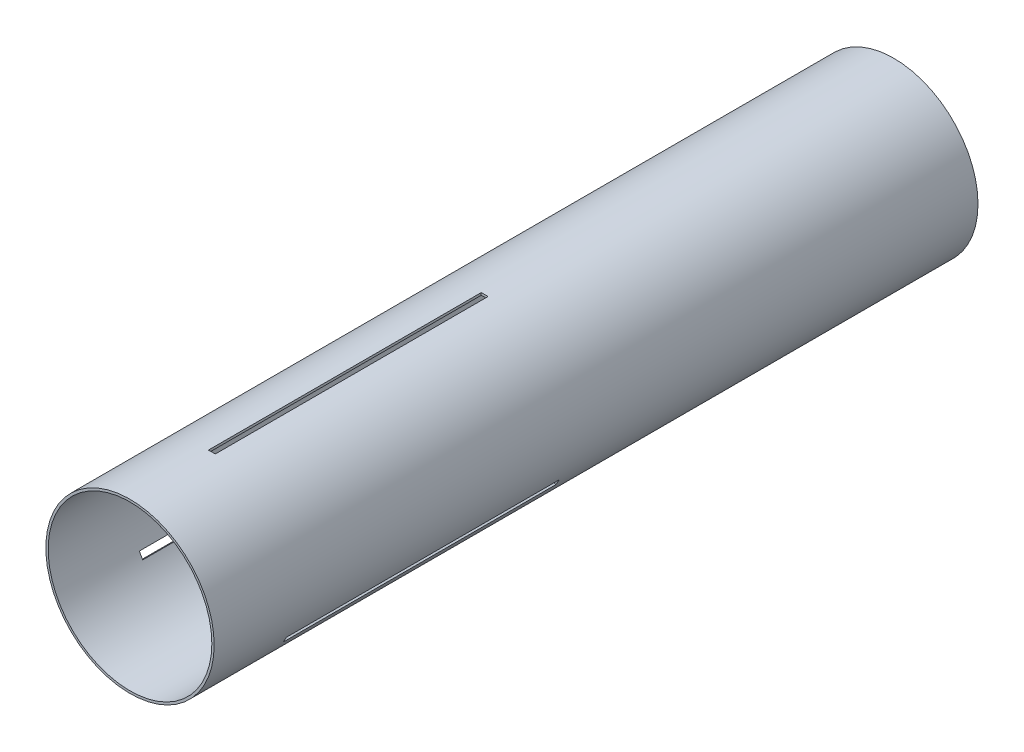
ISO-10303-21;
HEADER;
FILE_DESCRIPTION(('STEP AP214'),'2;1');
FILE_NAME('part.step','',(''),(''),'','','');
FILE_SCHEMA(('AUTOMOTIVE_DESIGN { 1 0 10303 214 1 1 1 1 }'));
ENDSEC;
DATA;
#1=APPLICATION_CONTEXT('core data for automotive mechanical design processes');
#2=APPLICATION_PROTOCOL_DEFINITION('international standard','automotive_design',2000,#1);
#3=PRODUCT_CONTEXT('',#1,'mechanical');
#4=PRODUCT('Part','Part','',(#3));
#5=PRODUCT_RELATED_PRODUCT_CATEGORY('part','',(#4));
#6=PRODUCT_DEFINITION_FORMATION('','',#4);
#7=PRODUCT_DEFINITION_CONTEXT('part definition',#1,'design');
#8=PRODUCT_DEFINITION('design','',#6,#7);
#9=PRODUCT_DEFINITION_SHAPE('','',#8);
#10=(LENGTH_UNIT() NAMED_UNIT(*) SI_UNIT(.MILLI.,.METRE.));
#11=(NAMED_UNIT(*) PLANE_ANGLE_UNIT() SI_UNIT($,.RADIAN.));
#12=(NAMED_UNIT(*) SI_UNIT($,.STERADIAN.) SOLID_ANGLE_UNIT());
#13=UNCERTAINTY_MEASURE_WITH_UNIT(LENGTH_MEASURE(1.E-05),#10,'distance_accuracy_value','');
#14=(GEOMETRIC_REPRESENTATION_CONTEXT(3) GLOBAL_UNCERTAINTY_ASSIGNED_CONTEXT((#13)) GLOBAL_UNIT_ASSIGNED_CONTEXT((#10,
#11,#12)) REPRESENTATION_CONTEXT('',''));
#15=CARTESIAN_POINT('',(0.,0.,0.));
#16=DIRECTION('',(0.,0.,1.));
#17=DIRECTION('',(1.,0.,0.));
#18=AXIS2_PLACEMENT_3D('',#15,#16,#17);
#19=CARTESIAN_POINT('',(0.,0.,711.2));
#20=DIRECTION('',(0.,0.,-1.));
#21=DIRECTION('',(-1.,0.,0.));
#22=AXIS2_PLACEMENT_3D('',#19,#20,#21);
#23=CYLINDRICAL_SURFACE('',#22,78.359);
#24=DIRECTION('',(0.,0.,-1.));
#25=VECTOR('',#24,1.);
#26=CARTESIAN_POINT('',(66.2176560871294,-41.8969557763647,711.2));
#27=LINE('',#26,#25);
#28=CARTESIAN_POINT('',(66.2176560871294,-41.8969557763646,381.000000000001));
#29=VERTEX_POINT('',#28);
#30=CARTESIAN_POINT('',(66.2176560871294,-41.8969557763646,635.));
#31=VERTEX_POINT('',#30);
#32=EDGE_CURVE('E154',#29,#31,#27,.F.);
#33=ORIENTED_EDGE('',*,*,#32,.T.);
#34=CARTESIAN_POINT('',(0.,0.,635.));
#35=DIRECTION('',(0.,0.,1.));
#36=DIRECTION('',(1.,0.,0.));
#37=AXIS2_PLACEMENT_3D('',#34,#35,#36);
#38=CIRCLE('',#37,78.359);
#39=CARTESIAN_POINT('',(69.3926560871294,-36.3976944623335,635.));
#40=VERTEX_POINT('',#39);
#41=EDGE_CURVE('E144',#31,#40,#38,.T.);
#42=ORIENTED_EDGE('',*,*,#41,.T.);
#43=DIRECTION('',(0.,0.,-1.));
#44=VECTOR('',#43,1.);
#45=CARTESIAN_POINT('',(69.3926560871294,-36.3976944623335,711.2));
#46=LINE('',#45,#44);
#47=CARTESIAN_POINT('',(69.3926560871294,-36.3976944623335,381.000000000001));
#48=VERTEX_POINT('',#47);
#49=EDGE_CURVE('E152',#48,#40,#46,.F.);
#50=ORIENTED_EDGE('',*,*,#49,.F.);
#51=CARTESIAN_POINT('',(0.,0.,381.000000000001));
#52=DIRECTION('',(0.,0.,1.));
#53=DIRECTION('',(1.,0.,0.));
#54=AXIS2_PLACEMENT_3D('',#51,#52,#53);
#55=CIRCLE('',#54,78.359);
#56=EDGE_CURVE('E145',#29,#48,#55,.T.);
#57=ORIENTED_EDGE('',*,*,#56,.F.);
#58=EDGE_LOOP('',(#33,#42,#50,#57));
#59=FACE_BOUND('',#58,.T.);
#60=DIRECTION('',(0.,0.,-1.));
#61=VECTOR('',#60,1.);
#62=CARTESIAN_POINT('',(-3.1750000000001,78.2946502386977,711.2));
#63=LINE('',#62,#61);
#64=CARTESIAN_POINT('',(-3.17500000000008,78.2946502386977,381.000000000001));
#65=VERTEX_POINT('',#64);
#66=CARTESIAN_POINT('',(-3.1750000000001,78.2946502386977,635.));
#67=VERTEX_POINT('',#66);
#68=EDGE_CURVE('E176',#65,#67,#63,.F.);
#69=ORIENTED_EDGE('',*,*,#68,.F.);
#70=CARTESIAN_POINT('',(0.,0.,381.000000000001));
#71=DIRECTION('',(0.,0.,1.));
#72=DIRECTION('',(1.,0.,0.));
#73=AXIS2_PLACEMENT_3D('',#70,#71,#72);
#74=CIRCLE('',#73,78.359);
#75=CARTESIAN_POINT('',(3.17499999999986,78.2946502386977,381.000000000001));
#76=VERTEX_POINT('',#75);
#77=EDGE_CURVE('E168',#76,#65,#74,.T.);
#78=ORIENTED_EDGE('',*,*,#77,.F.);
#79=DIRECTION('',(0.,0.,-1.));
#80=VECTOR('',#79,1.);
#81=CARTESIAN_POINT('',(3.17499999999992,78.2946502386977,711.2));
#82=LINE('',#81,#80);
#83=CARTESIAN_POINT('',(3.17499999999991,78.2946502386977,635.));
#84=VERTEX_POINT('',#83);
#85=EDGE_CURVE('E170',#76,#84,#82,.F.);
#86=ORIENTED_EDGE('',*,*,#85,.T.);
#87=CARTESIAN_POINT('',(0.,0.,635.));
#88=DIRECTION('',(0.,0.,1.));
#89=DIRECTION('',(1.,0.,0.));
#90=AXIS2_PLACEMENT_3D('',#87,#88,#89);
#91=CIRCLE('',#90,78.359);
#92=EDGE_CURVE('E173',#84,#67,#91,.T.);
#93=ORIENTED_EDGE('',*,*,#92,.T.);
#94=EDGE_LOOP('',(#69,#78,#86,#93));
#95=FACE_BOUND('',#94,.T.);
#96=CARTESIAN_POINT('',(0.,0.,711.2));
#97=DIRECTION('',(0.,0.,1.));
#98=DIRECTION('',(1.,0.,0.));
#99=AXIS2_PLACEMENT_3D('',#96,#97,#98);
#100=CIRCLE('',#99,78.359);
#101=CARTESIAN_POINT('',(78.359,0.,711.2));
#102=VERTEX_POINT('',#101);
#103=EDGE_CURVE('E185',#102,#102,#100,.T.);
#104=ORIENTED_EDGE('',*,*,#103,.F.);
#105=EDGE_LOOP('',(#104));
#106=FACE_BOUND('',#105,.T.);
#107=CARTESIAN_POINT('',(0.,0.,0.));
#108=DIRECTION('',(0.,0.,1.));
#109=DIRECTION('',(1.,0.,0.));
#110=AXIS2_PLACEMENT_3D('',#107,#108,#109);
#111=CIRCLE('',#110,78.359);
#112=CARTESIAN_POINT('',(78.359,0.,0.));
#113=VERTEX_POINT('',#112);
#114=EDGE_CURVE('E182',#113,#113,#111,.T.);
#115=ORIENTED_EDGE('',*,*,#114,.T.);
#116=EDGE_LOOP('',(#115));
#117=FACE_BOUND('',#116,.T.);
#118=DIRECTION('',(0.,0.,-1.));
#119=VECTOR('',#118,1.);
#120=CARTESIAN_POINT('',(-66.2176560871299,-41.8969557763639,711.2));
#121=LINE('',#120,#119);
#122=CARTESIAN_POINT('',(-66.2176560871299,-41.8969557763639,381.000000000001));
#123=VERTEX_POINT('',#122);
#124=CARTESIAN_POINT('',(-66.2176560871299,-41.8969557763639,635.));
#125=VERTEX_POINT('',#124);
#126=EDGE_CURVE('E130',#123,#125,#121,.F.);
#127=ORIENTED_EDGE('',*,*,#126,.F.);
#128=CARTESIAN_POINT('',(-69.3926560871298,-36.3976944623327,381.000000000001));
#129=VERTEX_POINT('',#128);
#130=EDGE_CURVE('E136',#129,#123,#55,.T.);
#131=ORIENTED_EDGE('',*,*,#130,.F.);
#132=DIRECTION('',(0.,0.,-1.));
#133=VECTOR('',#132,1.);
#134=CARTESIAN_POINT('',(-69.3926560871298,-36.3976944623327,711.2));
#135=LINE('',#134,#133);
#136=CARTESIAN_POINT('',(-69.3926560871298,-36.3976944623327,635.));
#137=VERTEX_POINT('',#136);
#138=EDGE_CURVE('E122',#129,#137,#135,.F.);
#139=ORIENTED_EDGE('',*,*,#138,.T.);
#140=EDGE_CURVE('E148',#137,#125,#38,.T.);
#141=ORIENTED_EDGE('',*,*,#140,.T.);
#142=EDGE_LOOP('',(#127,#131,#139,#141));
#143=FACE_BOUND('',#142,.T.);
#144=ADVANCED_FACE('F35',(#59,#95,#106,#117,#143),#23,.T.);
#145=CARTESIAN_POINT('',(0.,0.,711.2));
#146=DIRECTION('',(0.,0.,-1.));
#147=DIRECTION('',(-1.,0.,0.));
#148=AXIS2_PLACEMENT_3D('',#145,#146,#147);
#149=CYLINDRICAL_SURFACE('',#148,76.2);
#150=CARTESIAN_POINT('',(0.,0.,635.));
#151=DIRECTION('',(0.,0.,1.));
#152=DIRECTION('',(1.,0.,0.));
#153=AXIS2_PLACEMENT_3D('',#150,#151,#152);
#154=CIRCLE('',#153,76.2);
#155=CARTESIAN_POINT('',(64.3463269119121,-40.8165433733105,635.));
#156=VERTEX_POINT('',#155);
#157=CARTESIAN_POINT('',(67.5213269119121,-35.3172820592793,635.));
#158=VERTEX_POINT('',#157);
#159=EDGE_CURVE('E11',#156,#158,#154,.T.);
#160=ORIENTED_EDGE('',*,*,#159,.F.);
#161=DIRECTION('',(0.,0.,-1.));
#162=VECTOR('',#161,1.);
#163=CARTESIAN_POINT('',(64.3463269119121,-40.8165433733105,711.2));
#164=LINE('',#163,#162);
#165=CARTESIAN_POINT('',(64.3463269119121,-40.8165433733105,381.000000000001));
#166=VERTEX_POINT('',#165);
#167=EDGE_CURVE('E38',#166,#156,#164,.F.);
#168=ORIENTED_EDGE('',*,*,#167,.F.);
#169=CARTESIAN_POINT('',(0.,0.,381.000000000001));
#170=DIRECTION('',(0.,0.,1.));
#171=DIRECTION('',(1.,0.,0.));
#172=AXIS2_PLACEMENT_3D('',#169,#170,#171);
#173=CIRCLE('',#172,76.2);
#174=CARTESIAN_POINT('',(67.5213269119121,-35.3172820592794,381.000000000001));
#175=VERTEX_POINT('',#174);
#176=EDGE_CURVE('E202',#166,#175,#173,.T.);
#177=ORIENTED_EDGE('',*,*,#176,.T.);
#178=DIRECTION('',(0.,0.,-1.));
#179=VECTOR('',#178,1.);
#180=CARTESIAN_POINT('',(67.5213269119121,-35.3172820592793,711.2));
#181=LINE('',#180,#179);
#182=EDGE_CURVE('E206',#175,#158,#181,.F.);
#183=ORIENTED_EDGE('',*,*,#182,.T.);
#184=EDGE_LOOP('',(#160,#168,#177,#183));
#185=FACE_BOUND('',#184,.T.);
#186=CARTESIAN_POINT('',(0.,0.,711.2));
#187=DIRECTION('',(0.,0.,1.));
#188=DIRECTION('',(1.,0.,0.));
#189=AXIS2_PLACEMENT_3D('',#186,#187,#188);
#190=CIRCLE('',#189,76.2);
#191=CARTESIAN_POINT('',(76.2,0.,711.2));
#192=VERTEX_POINT('',#191);
#193=EDGE_CURVE('E179',#192,#192,#190,.T.);
#194=ORIENTED_EDGE('',*,*,#193,.T.);
#195=EDGE_LOOP('',(#194));
#196=FACE_BOUND('',#195,.T.);
#197=CARTESIAN_POINT('',(0.,0.,0.));
#198=DIRECTION('',(0.,0.,1.));
#199=DIRECTION('',(1.,0.,0.));
#200=AXIS2_PLACEMENT_3D('',#197,#198,#199);
#201=CIRCLE('',#200,76.2);
#202=CARTESIAN_POINT('',(76.2,0.,0.));
#203=VERTEX_POINT('',#202);
#204=EDGE_CURVE('E178',#203,#203,#201,.T.);
#205=ORIENTED_EDGE('',*,*,#204,.F.);
#206=EDGE_LOOP('',(#205));
#207=FACE_BOUND('',#206,.T.);
#208=CARTESIAN_POINT('',(0.,0.,381.000000000001));
#209=DIRECTION('',(0.,0.,1.));
#210=DIRECTION('',(1.,0.,0.));
#211=AXIS2_PLACEMENT_3D('',#208,#209,#210);
#212=CIRCLE('',#211,76.2);
#213=CARTESIAN_POINT('',(3.17499999999986,76.1338254325894,381.000000000001));
#214=VERTEX_POINT('',#213);
#215=CARTESIAN_POINT('',(-3.17500000000008,76.1338254325894,381.000000000001));
#216=VERTEX_POINT('',#215);
#217=EDGE_CURVE('E188',#214,#216,#212,.T.);
#218=ORIENTED_EDGE('',*,*,#217,.T.);
#219=DIRECTION('',(0.,0.,-1.));
#220=VECTOR('',#219,1.);
#221=CARTESIAN_POINT('',(-3.1750000000001,76.1338254325894,711.2));
#222=LINE('',#221,#220);
#223=CARTESIAN_POINT('',(-3.1750000000001,76.1338254325894,635.));
#224=VERTEX_POINT('',#223);
#225=EDGE_CURVE('E197',#216,#224,#222,.F.);
#226=ORIENTED_EDGE('',*,*,#225,.T.);
#227=CARTESIAN_POINT('',(0.,0.,635.));
#228=DIRECTION('',(0.,0.,1.));
#229=DIRECTION('',(1.,0.,0.));
#230=AXIS2_PLACEMENT_3D('',#227,#228,#229);
#231=CIRCLE('',#230,76.2);
#232=CARTESIAN_POINT('',(3.17499999999991,76.1338254325894,635.));
#233=VERTEX_POINT('',#232);
#234=EDGE_CURVE('E195',#233,#224,#231,.T.);
#235=ORIENTED_EDGE('',*,*,#234,.F.);
#236=DIRECTION('',(0.,0.,-1.));
#237=VECTOR('',#236,1.);
#238=CARTESIAN_POINT('',(3.17499999999992,76.1338254325894,711.2));
#239=LINE('',#238,#237);
#240=EDGE_CURVE('E193',#214,#233,#239,.F.);
#241=ORIENTED_EDGE('',*,*,#240,.F.);
#242=EDGE_LOOP('',(#218,#226,#235,#241));
#243=FACE_BOUND('',#242,.T.);
#244=CARTESIAN_POINT('',(-67.5213269119125,-35.3172820592786,381.000000000001));
#245=VERTEX_POINT('',#244);
#246=CARTESIAN_POINT('',(-64.3463269119126,-40.8165433733098,381.000000000001));
#247=VERTEX_POINT('',#246);
#248=EDGE_CURVE('E139',#245,#247,#173,.T.);
#249=ORIENTED_EDGE('',*,*,#248,.T.);
#250=DIRECTION('',(0.,0.,-1.));
#251=VECTOR('',#250,1.);
#252=CARTESIAN_POINT('',(-64.3463269119126,-40.8165433733098,711.2));
#253=LINE('',#252,#251);
#254=CARTESIAN_POINT('',(-64.3463269119126,-40.8165433733098,635.));
#255=VERTEX_POINT('',#254);
#256=EDGE_CURVE('E204',#247,#255,#253,.F.);
#257=ORIENTED_EDGE('',*,*,#256,.T.);
#258=CARTESIAN_POINT('',(-67.5213269119125,-35.3172820592786,635.));
#259=VERTEX_POINT('',#258);
#260=EDGE_CURVE('E44',#259,#255,#154,.T.);
#261=ORIENTED_EDGE('',*,*,#260,.F.);
#262=DIRECTION('',(0.,0.,-1.));
#263=VECTOR('',#262,1.);
#264=CARTESIAN_POINT('',(-67.5213269119125,-35.3172820592786,711.2));
#265=LINE('',#264,#263);
#266=EDGE_CURVE('E200',#245,#259,#265,.F.);
#267=ORIENTED_EDGE('',*,*,#266,.F.);
#268=EDGE_LOOP('',(#249,#257,#261,#267));
#269=FACE_BOUND('',#268,.T.);
#270=ADVANCED_FACE('F213',(#185,#196,#207,#243,#269),#149,.F.);
#271=CARTESIAN_POINT('',(0.,0.,711.2));
#272=DIRECTION('',(0.,0.,1.));
#273=DIRECTION('',(1.,0.,0.));
#274=AXIS2_PLACEMENT_3D('',#271,#272,#273);
#275=PLANE('',#274);
#276=ORIENTED_EDGE('',*,*,#103,.T.);
#277=EDGE_LOOP('',(#276));
#278=FACE_BOUND('',#277,.T.);
#279=ORIENTED_EDGE('',*,*,#193,.F.);
#280=EDGE_LOOP('',(#279));
#281=FACE_BOUND('',#280,.T.);
#282=ADVANCED_FACE('F251',(#278,#281),#275,.T.);
#283=CARTESIAN_POINT('',(0.,0.,0.));
#284=DIRECTION('',(0.,0.,1.));
#285=DIRECTION('',(1.,0.,0.));
#286=AXIS2_PLACEMENT_3D('',#283,#284,#285);
#287=PLANE('',#286);
#288=ORIENTED_EDGE('',*,*,#114,.F.);
#289=EDGE_LOOP('',(#288));
#290=FACE_BOUND('',#289,.T.);
#291=ORIENTED_EDGE('',*,*,#204,.T.);
#292=EDGE_LOOP('',(#291));
#293=FACE_BOUND('',#292,.T.);
#294=ADVANCED_FACE('F247',(#290,#293),#287,.F.);
#295=CARTESIAN_POINT('',(-3.17500000000008,153.416,381.000000000001));
#296=DIRECTION('',(1.,0.,0.));
#297=DIRECTION('',(0.,0.,-1.));
#298=AXIS2_PLACEMENT_3D('',#295,#296,#297);
#299=PLANE('',#298);
#300=ORIENTED_EDGE('',*,*,#68,.T.);
#301=DIRECTION('',(0.,-1.,0.));
#302=VECTOR('',#301,1.);
#303=CARTESIAN_POINT('',(-3.1750000000001,153.416,635.));
#304=LINE('',#303,#302);
#305=EDGE_CURVE('E165',#67,#224,#304,.T.);
#306=ORIENTED_EDGE('',*,*,#305,.T.);
#307=ORIENTED_EDGE('',*,*,#225,.F.);
#308=DIRECTION('',(0.,-1.,0.));
#309=VECTOR('',#308,1.);
#310=CARTESIAN_POINT('',(-3.17500000000008,153.416,381.000000000001));
#311=LINE('',#310,#309);
#312=EDGE_CURVE('E157',#65,#216,#311,.T.);
#313=ORIENTED_EDGE('',*,*,#312,.F.);
#314=EDGE_LOOP('',(#300,#306,#307,#313));
#315=FACE_BOUND('',#314,.T.);
#316=ADVANCED_FACE('F250',(#315),#299,.T.);
#317=CARTESIAN_POINT('',(3.17499999999991,153.416,635.));
#318=DIRECTION('',(0.,0.,1.));
#319=DIRECTION('',(1.,0.,0.));
#320=AXIS2_PLACEMENT_3D('',#317,#318,#319);
#321=PLANE('',#320);
#322=DIRECTION('',(0.,-1.,0.));
#323=VECTOR('',#322,1.);
#324=CARTESIAN_POINT('',(3.17499999999991,153.416,635.));
#325=LINE('',#324,#323);
#326=EDGE_CURVE('E162',#84,#233,#325,.T.);
#327=ORIENTED_EDGE('',*,*,#326,.T.);
#328=ORIENTED_EDGE('',*,*,#234,.T.);
#329=ORIENTED_EDGE('',*,*,#305,.F.);
#330=ORIENTED_EDGE('',*,*,#92,.F.);
#331=EDGE_LOOP('',(#327,#328,#329,#330));
#332=FACE_BOUND('',#331,.T.);
#333=ADVANCED_FACE('F290',(#332),#321,.F.);
#334=CARTESIAN_POINT('',(3.17499999999986,153.416,381.000000000001));
#335=DIRECTION('',(1.,0.,0.));
#336=DIRECTION('',(0.,0.,-1.));
#337=AXIS2_PLACEMENT_3D('',#334,#335,#336);
#338=PLANE('',#337);
#339=DIRECTION('',(0.,-1.,0.));
#340=VECTOR('',#339,1.);
#341=CARTESIAN_POINT('',(3.17499999999986,153.416,381.000000000001));
#342=LINE('',#341,#340);
#343=EDGE_CURVE('E159',#76,#214,#342,.T.);
#344=ORIENTED_EDGE('',*,*,#343,.T.);
#345=ORIENTED_EDGE('',*,*,#240,.T.);
#346=ORIENTED_EDGE('',*,*,#326,.F.);
#347=ORIENTED_EDGE('',*,*,#85,.F.);
#348=EDGE_LOOP('',(#344,#345,#346,#347));
#349=FACE_BOUND('',#348,.T.);
#350=ADVANCED_FACE('F276',(#349),#338,.F.);
#351=CARTESIAN_POINT('',(3.17499999999986,153.416,381.000000000001));
#352=DIRECTION('',(0.,0.,1.));
#353=DIRECTION('',(1.,0.,0.));
#354=AXIS2_PLACEMENT_3D('',#351,#352,#353);
#355=PLANE('',#354);
#356=ORIENTED_EDGE('',*,*,#77,.T.);
#357=ORIENTED_EDGE('',*,*,#312,.T.);
#358=ORIENTED_EDGE('',*,*,#217,.F.);
#359=ORIENTED_EDGE('',*,*,#343,.F.);
#360=EDGE_LOOP('',(#356,#357,#358,#359));
#361=FACE_BOUND('',#360,.T.);
#362=ADVANCED_FACE('F269',(#361),#355,.T.);
#363=CARTESIAN_POINT('',(-131.274653346994,-79.4576306570145,381.000000000001));
#364=DIRECTION('',(-0.499999999999992,0.866025403784443,0.));
#365=DIRECTION('',(-0.866025403784443,-0.499999999999992,0.));
#366=AXIS2_PLACEMENT_3D('',#363,#364,#365);
#367=PLANE('',#366);
#368=ORIENTED_EDGE('',*,*,#126,.T.);
#369=DIRECTION('',(0.866025403784443,0.499999999999992,0.));
#370=VECTOR('',#369,1.);
#371=CARTESIAN_POINT('',(-131.274653346994,-79.4576306570145,635.));
#372=LINE('',#371,#370);
#373=EDGE_CURVE('E226',#125,#255,#372,.T.);
#374=ORIENTED_EDGE('',*,*,#373,.T.);
#375=ORIENTED_EDGE('',*,*,#256,.F.);
#376=DIRECTION('',(0.866025403784443,0.499999999999992,0.));
#377=VECTOR('',#376,1.);
#378=CARTESIAN_POINT('',(-131.274653346994,-79.4576306570145,381.000000000001));
#379=LINE('',#378,#377);
#380=EDGE_CURVE('E141',#123,#247,#379,.T.);
#381=ORIENTED_EDGE('',*,*,#380,.F.);
#382=EDGE_LOOP('',(#368,#374,#375,#381));
#383=FACE_BOUND('',#382,.T.);
#384=ADVANCED_FACE('F267',(#383),#367,.T.);
#385=CARTESIAN_POINT('',(-134.449653346994,-73.9583693429833,381.000000000001));
#386=DIRECTION('',(-0.499999999999992,0.866025403784443,0.));
#387=DIRECTION('',(-0.866025403784443,-0.499999999999992,0.));
#388=AXIS2_PLACEMENT_3D('',#385,#386,#387);
#389=PLANE('',#388);
#390=DIRECTION('',(0.866025403784443,0.499999999999992,0.));
#391=VECTOR('',#390,1.);
#392=CARTESIAN_POINT('',(-134.449653346994,-73.9583693429833,381.000000000001));
#393=LINE('',#392,#391);
#394=EDGE_CURVE('E125',#129,#245,#393,.T.);
#395=ORIENTED_EDGE('',*,*,#394,.T.);
#396=ORIENTED_EDGE('',*,*,#266,.T.);
#397=DIRECTION('',(0.866025403784443,0.499999999999992,0.));
#398=VECTOR('',#397,1.);
#399=CARTESIAN_POINT('',(-134.449653346994,-73.9583693429832,635.));
#400=LINE('',#399,#398);
#401=EDGE_CURVE('E59',#137,#259,#400,.T.);
#402=ORIENTED_EDGE('',*,*,#401,.F.);
#403=ORIENTED_EDGE('',*,*,#138,.F.);
#404=EDGE_LOOP('',(#395,#396,#402,#403));
#405=FACE_BOUND('',#404,.T.);
#406=ADVANCED_FACE('F124',(#405),#389,.F.);
#407=CARTESIAN_POINT('',(131.274653346993,-79.4576306570161,381.000000000001));
#408=DIRECTION('',(0.,0.,1.));
#409=DIRECTION('',(1.,0.,0.));
#410=AXIS2_PLACEMENT_3D('',#407,#408,#409);
#411=PLANE('',#410);
#412=ORIENTED_EDGE('',*,*,#130,.T.);
#413=ORIENTED_EDGE('',*,*,#380,.T.);
#414=ORIENTED_EDGE('',*,*,#248,.F.);
#415=ORIENTED_EDGE('',*,*,#394,.F.);
#416=EDGE_LOOP('',(#412,#413,#414,#415));
#417=FACE_BOUND('',#416,.T.);
#418=ADVANCED_FACE('F134',(#417),#411,.T.);
#419=CARTESIAN_POINT('',(131.274653346993,-79.4576306570161,635.));
#420=DIRECTION('',(0.,0.,1.));
#421=DIRECTION('',(1.,0.,0.));
#422=AXIS2_PLACEMENT_3D('',#419,#420,#421);
#423=PLANE('',#422);
#424=ORIENTED_EDGE('',*,*,#401,.T.);
#425=ORIENTED_EDGE('',*,*,#260,.T.);
#426=ORIENTED_EDGE('',*,*,#373,.F.);
#427=ORIENTED_EDGE('',*,*,#140,.F.);
#428=EDGE_LOOP('',(#424,#425,#426,#427));
#429=FACE_BOUND('',#428,.T.);
#430=ADVANCED_FACE('F261',(#429),#423,.F.);
#431=CARTESIAN_POINT('',(131.274653346993,-79.4576306570161,381.000000000001));
#432=DIRECTION('',(-0.500000000000004,-0.866025403784436,0.));
#433=DIRECTION('',(0.866025403784436,-0.500000000000004,0.));
#434=AXIS2_PLACEMENT_3D('',#431,#432,#433);
#435=PLANE('',#434);
#436=DIRECTION('',(-0.866025403784436,0.500000000000004,0.));
#437=VECTOR('',#436,1.);
#438=CARTESIAN_POINT('',(131.274653346993,-79.4576306570161,381.000000000001));
#439=LINE('',#438,#437);
#440=EDGE_CURVE('E51',#29,#166,#439,.T.);
#441=ORIENTED_EDGE('',*,*,#440,.T.);
#442=ORIENTED_EDGE('',*,*,#167,.T.);
#443=DIRECTION('',(-0.866025403784436,0.500000000000004,0.));
#444=VECTOR('',#443,1.);
#445=CARTESIAN_POINT('',(131.274653346993,-79.4576306570161,635.));
#446=LINE('',#445,#444);
#447=EDGE_CURVE('E223',#31,#156,#446,.T.);
#448=ORIENTED_EDGE('',*,*,#447,.F.);
#449=ORIENTED_EDGE('',*,*,#32,.F.);
#450=EDGE_LOOP('',(#441,#442,#448,#449));
#451=FACE_BOUND('',#450,.T.);
#452=ADVANCED_FACE('F219',(#451),#435,.F.);
#453=CARTESIAN_POINT('',(134.449653346993,-73.958369342985,381.000000000001));
#454=DIRECTION('',(-0.500000000000004,-0.866025403784436,0.));
#455=DIRECTION('',(0.866025403784436,-0.500000000000004,0.));
#456=AXIS2_PLACEMENT_3D('',#453,#454,#455);
#457=PLANE('',#456);
#458=ORIENTED_EDGE('',*,*,#49,.T.);
#459=DIRECTION('',(-0.866025403784436,0.500000000000004,0.));
#460=VECTOR('',#459,1.);
#461=CARTESIAN_POINT('',(134.449653346993,-73.958369342985,635.));
#462=LINE('',#461,#460);
#463=EDGE_CURVE('E131',#40,#158,#462,.T.);
#464=ORIENTED_EDGE('',*,*,#463,.T.);
#465=ORIENTED_EDGE('',*,*,#182,.F.);
#466=DIRECTION('',(-0.866025403784436,0.500000000000004,0.));
#467=VECTOR('',#466,1.);
#468=CARTESIAN_POINT('',(134.449653346993,-73.958369342985,381.000000000001));
#469=LINE('',#468,#467);
#470=EDGE_CURVE('E217',#48,#175,#469,.T.);
#471=ORIENTED_EDGE('',*,*,#470,.F.);
#472=EDGE_LOOP('',(#458,#464,#465,#471));
#473=FACE_BOUND('',#472,.T.);
#474=ADVANCED_FACE('F233',(#473),#457,.T.);
#475=ORIENTED_EDGE('',*,*,#447,.T.);
#476=ORIENTED_EDGE('',*,*,#159,.T.);
#477=ORIENTED_EDGE('',*,*,#463,.F.);
#478=ORIENTED_EDGE('',*,*,#41,.F.);
#479=EDGE_LOOP('',(#475,#476,#477,#478));
#480=FACE_BOUND('',#479,.T.);
#481=ADVANCED_FACE('F236',(#480),#423,.F.);
#482=ORIENTED_EDGE('',*,*,#56,.T.);
#483=ORIENTED_EDGE('',*,*,#470,.T.);
#484=ORIENTED_EDGE('',*,*,#176,.F.);
#485=ORIENTED_EDGE('',*,*,#440,.F.);
#486=EDGE_LOOP('',(#482,#483,#484,#485));
#487=FACE_BOUND('',#486,.T.);
#488=ADVANCED_FACE('F215',(#487),#411,.T.);
#489=CLOSED_SHELL('',(#144,#270,#282,#294,#316,#333,#350,#362,#384,#406,#418,#430,#452,#474,
#481,#488));
#490=MANIFOLD_SOLID_BREP('B2',#489);
#491=ADVANCED_BREP_SHAPE_REPRESENTATION('',(#18,#490),#14);
#492=SHAPE_DEFINITION_REPRESENTATION(#9,#491);
ENDSEC;
END-ISO-10303-21;
